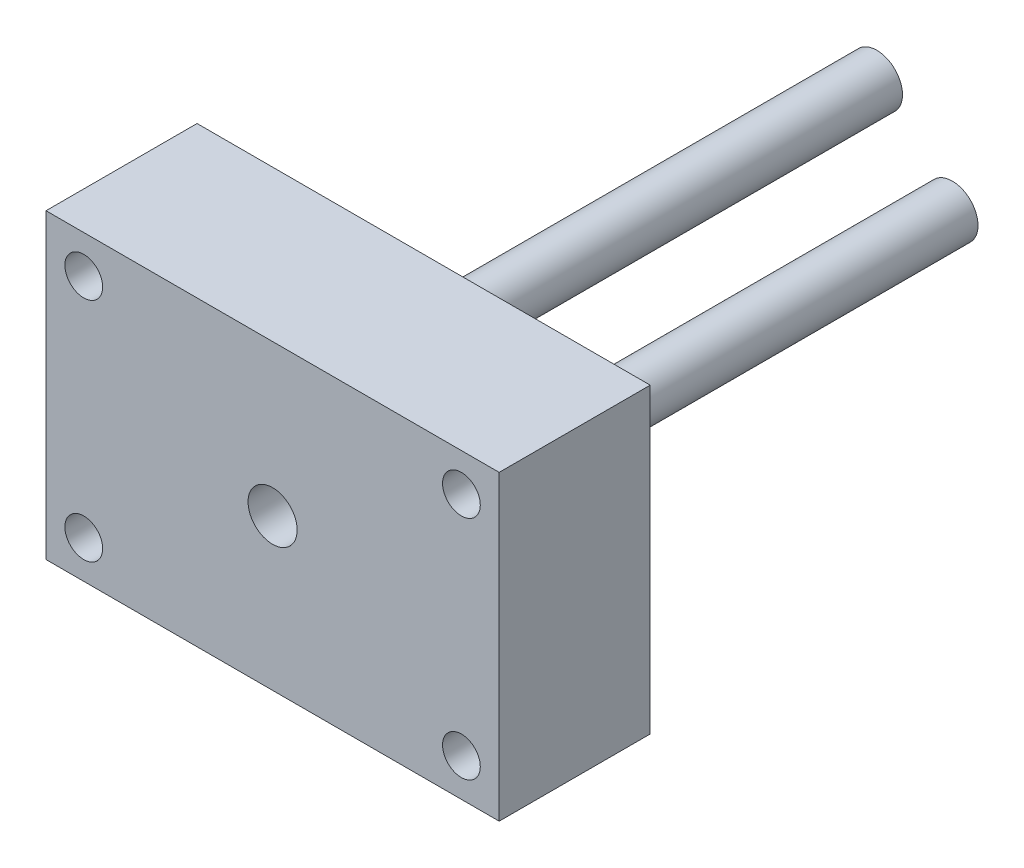
ISO-10303-21;
HEADER;
FILE_DESCRIPTION(('STEP AP214'),'2;1');
FILE_NAME('part.step','',(''),(''),'','','');
FILE_SCHEMA(('AUTOMOTIVE_DESIGN { 1 0 10303 214 1 1 1 1 }'));
ENDSEC;
DATA;
#1=APPLICATION_CONTEXT('core data for automotive mechanical design processes');
#2=APPLICATION_PROTOCOL_DEFINITION('international standard','automotive_design',2000,#1);
#3=PRODUCT_CONTEXT('',#1,'mechanical');
#4=PRODUCT('Part','Part','',(#3));
#5=PRODUCT_RELATED_PRODUCT_CATEGORY('part','',(#4));
#6=PRODUCT_DEFINITION_FORMATION('','',#4);
#7=PRODUCT_DEFINITION_CONTEXT('part definition',#1,'design');
#8=PRODUCT_DEFINITION('design','',#6,#7);
#9=PRODUCT_DEFINITION_SHAPE('','',#8);
#10=(LENGTH_UNIT() NAMED_UNIT(*) SI_UNIT(.MILLI.,.METRE.));
#11=(NAMED_UNIT(*) PLANE_ANGLE_UNIT() SI_UNIT($,.RADIAN.));
#12=(NAMED_UNIT(*) SI_UNIT($,.STERADIAN.) SOLID_ANGLE_UNIT());
#13=UNCERTAINTY_MEASURE_WITH_UNIT(LENGTH_MEASURE(1.E-05),#10,'distance_accuracy_value','');
#14=(GEOMETRIC_REPRESENTATION_CONTEXT(3) GLOBAL_UNCERTAINTY_ASSIGNED_CONTEXT((#13)) GLOBAL_UNIT_ASSIGNED_CONTEXT((#10,
#11,#12)) REPRESENTATION_CONTEXT('',''));
#15=CARTESIAN_POINT('',(0.,0.,0.));
#16=DIRECTION('',(0.,0.,1.));
#17=DIRECTION('',(1.,0.,0.));
#18=AXIS2_PLACEMENT_3D('',#15,#16,#17);
#19=CARTESIAN_POINT('',(0.,0.,25.4));
#20=DIRECTION('',(0.,0.,-1.));
#21=DIRECTION('',(-1.,0.,0.));
#22=AXIS2_PLACEMENT_3D('',#19,#20,#21);
#23=PLANE('',#22);
#24=CARTESIAN_POINT('',(69.8500000000004,6.34999999999999,25.4));
#25=DIRECTION('',(0.,0.,1.));
#26=DIRECTION('',(1.,0.,0.));
#27=AXIS2_PLACEMENT_3D('',#24,#25,#26);
#28=CIRCLE('',#27,3.175);
#29=CARTESIAN_POINT('',(73.0250000000004,6.34999999999999,25.4));
#30=VERTEX_POINT('',#29);
#31=EDGE_CURVE('E232',#30,#30,#28,.T.);
#32=ORIENTED_EDGE('',*,*,#31,.F.);
#33=EDGE_LOOP('',(#32));
#34=FACE_BOUND('',#33,.T.);
#35=CARTESIAN_POINT('',(6.3500000000004,6.34999999999999,25.4));
#36=DIRECTION('',(0.,0.,1.));
#37=DIRECTION('',(1.,0.,0.));
#38=AXIS2_PLACEMENT_3D('',#35,#36,#37);
#39=CIRCLE('',#38,3.175);
#40=CARTESIAN_POINT('',(9.5250000000004,6.34999999999999,25.4));
#41=VERTEX_POINT('',#40);
#42=EDGE_CURVE('E264',#41,#41,#39,.T.);
#43=ORIENTED_EDGE('',*,*,#42,.F.);
#44=EDGE_LOOP('',(#43));
#45=FACE_BOUND('',#44,.T.);
#46=CARTESIAN_POINT('',(69.85,44.45,25.4));
#47=DIRECTION('',(0.,0.,1.));
#48=DIRECTION('',(1.,0.,0.));
#49=AXIS2_PLACEMENT_3D('',#46,#47,#48);
#50=CIRCLE('',#49,3.175);
#51=CARTESIAN_POINT('',(73.025,44.45,25.4));
#52=VERTEX_POINT('',#51);
#53=EDGE_CURVE('E256',#52,#52,#50,.T.);
#54=ORIENTED_EDGE('',*,*,#53,.F.);
#55=EDGE_LOOP('',(#54));
#56=FACE_BOUND('',#55,.T.);
#57=CARTESIAN_POINT('',(6.35,44.45,25.4));
#58=DIRECTION('',(0.,0.,1.));
#59=DIRECTION('',(1.,0.,0.));
#60=AXIS2_PLACEMENT_3D('',#57,#58,#59);
#61=CIRCLE('',#60,3.175);
#62=CARTESIAN_POINT('',(9.525,44.45,25.4));
#63=VERTEX_POINT('',#62);
#64=EDGE_CURVE('E248',#63,#63,#61,.T.);
#65=ORIENTED_EDGE('',*,*,#64,.F.);
#66=EDGE_LOOP('',(#65));
#67=FACE_BOUND('',#66,.T.);
#68=CARTESIAN_POINT('',(38.1,25.4,25.4));
#69=DIRECTION('',(0.,0.,1.));
#70=DIRECTION('',(1.,0.,0.));
#71=AXIS2_PLACEMENT_3D('',#68,#69,#70);
#72=CIRCLE('',#71,4.1275);
#73=CARTESIAN_POINT('',(42.2275,25.4,25.4));
#74=VERTEX_POINT('',#73);
#75=EDGE_CURVE('E247',#74,#74,#72,.T.);
#76=ORIENTED_EDGE('',*,*,#75,.F.);
#77=EDGE_LOOP('',(#76));
#78=FACE_BOUND('',#77,.T.);
#79=DIRECTION('',(0.,-1.,0.));
#80=VECTOR('',#79,1.);
#81=CARTESIAN_POINT('',(0.,0.,25.4));
#82=LINE('',#81,#80);
#83=CARTESIAN_POINT('',(0.,50.8,25.4));
#84=VERTEX_POINT('',#83);
#85=CARTESIAN_POINT('',(0.,0.,25.4));
#86=VERTEX_POINT('',#85);
#87=EDGE_CURVE('E95',#84,#86,#82,.T.);
#88=ORIENTED_EDGE('',*,*,#87,.T.);
#89=DIRECTION('',(1.,0.,0.));
#90=VECTOR('',#89,1.);
#91=CARTESIAN_POINT('',(0.,0.,25.4));
#92=LINE('',#91,#90);
#93=CARTESIAN_POINT('',(76.2,0.,25.4));
#94=VERTEX_POINT('',#93);
#95=EDGE_CURVE('E91',#86,#94,#92,.T.);
#96=ORIENTED_EDGE('',*,*,#95,.T.);
#97=DIRECTION('',(0.,1.,0.));
#98=VECTOR('',#97,1.);
#99=CARTESIAN_POINT('',(76.2,0.,25.4));
#100=LINE('',#99,#98);
#101=CARTESIAN_POINT('',(76.2,50.8,25.4));
#102=VERTEX_POINT('',#101);
#103=EDGE_CURVE('E93',#94,#102,#100,.T.);
#104=ORIENTED_EDGE('',*,*,#103,.T.);
#105=DIRECTION('',(-1.,0.,0.));
#106=VECTOR('',#105,1.);
#107=CARTESIAN_POINT('',(0.,50.8,25.4));
#108=LINE('',#107,#106);
#109=EDGE_CURVE('E61',#102,#84,#108,.T.);
#110=ORIENTED_EDGE('',*,*,#109,.T.);
#111=EDGE_LOOP('',(#88,#96,#104,#110));
#112=FACE_BOUND('',#111,.T.);
#113=ADVANCED_FACE('F39',(#34,#45,#56,#67,#78,#112),#23,.F.);
#114=CARTESIAN_POINT('',(0.,0.,0.));
#115=DIRECTION('',(0.,0.,-1.));
#116=DIRECTION('',(-1.,0.,0.));
#117=AXIS2_PLACEMENT_3D('',#114,#115,#116);
#118=PLANE('',#117);
#119=CARTESIAN_POINT('',(38.0978420618941,38.1012632859385,0.));
#120=DIRECTION('',(0.,0.,-1.));
#121=DIRECTION('',(0.862996570072247,-0.50520977825408,0.));
#122=AXIS2_PLACEMENT_3D('',#119,#120,#121);
#123=CIRCLE('',#122,4.31615582770865);
#124=CARTESIAN_POINT('',(41.822669737104,35.9206991573118,0.));
#125=VERTEX_POINT('',#124);
#126=EDGE_CURVE('E129',#125,#125,#123,.T.);
#127=ORIENTED_EDGE('',*,*,#126,.F.);
#128=EDGE_LOOP('',(#127));
#129=FACE_BOUND('',#128,.T.);
#130=CARTESIAN_POINT('',(69.8500000000004,6.34999999999999,0.));
#131=DIRECTION('',(0.,0.,1.));
#132=DIRECTION('',(1.,0.,0.));
#133=AXIS2_PLACEMENT_3D('',#130,#131,#132);
#134=CIRCLE('',#133,3.175);
#135=CARTESIAN_POINT('',(73.0250000000004,6.34999999999999,0.));
#136=VERTEX_POINT('',#135);
#137=EDGE_CURVE('E238',#136,#136,#134,.T.);
#138=ORIENTED_EDGE('',*,*,#137,.T.);
#139=EDGE_LOOP('',(#138));
#140=FACE_BOUND('',#139,.T.);
#141=CARTESIAN_POINT('',(6.3500000000004,6.34999999999999,0.));
#142=DIRECTION('',(0.,0.,1.));
#143=DIRECTION('',(1.,0.,0.));
#144=AXIS2_PLACEMENT_3D('',#141,#142,#143);
#145=CIRCLE('',#144,3.175);
#146=CARTESIAN_POINT('',(9.5250000000004,6.34999999999999,0.));
#147=VERTEX_POINT('',#146);
#148=EDGE_CURVE('E260',#147,#147,#145,.T.);
#149=ORIENTED_EDGE('',*,*,#148,.T.);
#150=EDGE_LOOP('',(#149));
#151=FACE_BOUND('',#150,.T.);
#152=CARTESIAN_POINT('',(69.85,44.45,0.));
#153=DIRECTION('',(0.,0.,1.));
#154=DIRECTION('',(1.,0.,0.));
#155=AXIS2_PLACEMENT_3D('',#152,#153,#154);
#156=CIRCLE('',#155,3.175);
#157=CARTESIAN_POINT('',(73.025,44.45,0.));
#158=VERTEX_POINT('',#157);
#159=EDGE_CURVE('E252',#158,#158,#156,.T.);
#160=ORIENTED_EDGE('',*,*,#159,.T.);
#161=EDGE_LOOP('',(#160));
#162=FACE_BOUND('',#161,.T.);
#163=CARTESIAN_POINT('',(6.35,44.45,0.));
#164=DIRECTION('',(0.,0.,1.));
#165=DIRECTION('',(1.,0.,0.));
#166=AXIS2_PLACEMENT_3D('',#163,#164,#165);
#167=CIRCLE('',#166,3.175);
#168=CARTESIAN_POINT('',(9.525,44.45,0.));
#169=VERTEX_POINT('',#168);
#170=EDGE_CURVE('E243',#169,#169,#167,.T.);
#171=ORIENTED_EDGE('',*,*,#170,.T.);
#172=EDGE_LOOP('',(#171));
#173=FACE_BOUND('',#172,.T.);
#174=CARTESIAN_POINT('',(38.1,25.4,0.));
#175=DIRECTION('',(0.,0.,1.));
#176=DIRECTION('',(1.,0.,0.));
#177=AXIS2_PLACEMENT_3D('',#174,#175,#176);
#178=CIRCLE('',#177,4.1275);
#179=CARTESIAN_POINT('',(42.2275,25.4,0.));
#180=VERTEX_POINT('',#179);
#181=EDGE_CURVE('E116',#180,#180,#178,.T.);
#182=ORIENTED_EDGE('',*,*,#181,.T.);
#183=EDGE_LOOP('',(#182));
#184=FACE_BOUND('',#183,.T.);
#185=CARTESIAN_POINT('',(38.1000000000088,12.7,0.));
#186=DIRECTION('',(0.,0.,-1.));
#187=DIRECTION('',(-1.,0.,0.));
#188=AXIS2_PLACEMENT_3D('',#185,#186,#187);
#189=CIRCLE('',#188,4.31365531013888);
#190=CARTESIAN_POINT('',(33.7863446898699,12.7,0.));
#191=VERTEX_POINT('',#190);
#192=EDGE_CURVE('E143',#191,#191,#189,.T.);
#193=ORIENTED_EDGE('',*,*,#192,.F.);
#194=EDGE_LOOP('',(#193));
#195=FACE_BOUND('',#194,.T.);
#196=DIRECTION('',(0.,-1.,0.));
#197=VECTOR('',#196,1.);
#198=CARTESIAN_POINT('',(0.,0.,0.));
#199=LINE('',#198,#197);
#200=CARTESIAN_POINT('',(0.,50.8,0.));
#201=VERTEX_POINT('',#200);
#202=CARTESIAN_POINT('',(0.,0.,0.));
#203=VERTEX_POINT('',#202);
#204=EDGE_CURVE('E112',#201,#203,#199,.T.);
#205=ORIENTED_EDGE('',*,*,#204,.F.);
#206=DIRECTION('',(-1.,0.,0.));
#207=VECTOR('',#206,1.);
#208=CARTESIAN_POINT('',(0.,50.8,0.));
#209=LINE('',#208,#207);
#210=CARTESIAN_POINT('',(76.2,50.8,0.));
#211=VERTEX_POINT('',#210);
#212=EDGE_CURVE('E84',#211,#201,#209,.T.);
#213=ORIENTED_EDGE('',*,*,#212,.F.);
#214=DIRECTION('',(0.,1.,0.));
#215=VECTOR('',#214,1.);
#216=CARTESIAN_POINT('',(76.2,0.,0.));
#217=LINE('',#216,#215);
#218=CARTESIAN_POINT('',(76.2,0.,0.));
#219=VERTEX_POINT('',#218);
#220=EDGE_CURVE('E78',#219,#211,#217,.T.);
#221=ORIENTED_EDGE('',*,*,#220,.F.);
#222=DIRECTION('',(1.,0.,0.));
#223=VECTOR('',#222,1.);
#224=CARTESIAN_POINT('',(0.,0.,0.));
#225=LINE('',#224,#223);
#226=EDGE_CURVE('E100',#203,#219,#225,.T.);
#227=ORIENTED_EDGE('',*,*,#226,.F.);
#228=EDGE_LOOP('',(#205,#213,#221,#227));
#229=FACE_BOUND('',#228,.T.);
#230=CARTESIAN_POINT('',(50.8000000000044,25.4000000000044,0.));
#231=DIRECTION('',(0.,0.,-1.));
#232=DIRECTION('',(-1.,0.,0.));
#233=AXIS2_PLACEMENT_3D('',#230,#231,#232);
#234=CIRCLE('',#233,4.31365531011594);
#235=CARTESIAN_POINT('',(46.4863446898885,25.4000000000044,0.));
#236=VERTEX_POINT('',#235);
#237=EDGE_CURVE('E140',#236,#236,#234,.T.);
#238=ORIENTED_EDGE('',*,*,#237,.F.);
#239=EDGE_LOOP('',(#238));
#240=FACE_BOUND('',#239,.T.);
#241=CARTESIAN_POINT('',(25.4000000000044,25.3999999999957,0.));
#242=DIRECTION('',(0.,0.,-1.));
#243=DIRECTION('',(-1.,0.,0.));
#244=AXIS2_PLACEMENT_3D('',#241,#242,#243);
#245=CIRCLE('',#244,4.31365531011593);
#246=CARTESIAN_POINT('',(21.0863446898885,25.3999999999957,0.));
#247=VERTEX_POINT('',#246);
#248=EDGE_CURVE('E230',#247,#247,#245,.T.);
#249=ORIENTED_EDGE('',*,*,#248,.F.);
#250=EDGE_LOOP('',(#249));
#251=FACE_BOUND('',#250,.T.);
#252=ADVANCED_FACE('F130',(#129,#140,#151,#162,#173,#184,#195,#229,#240,#251),#118,.T.);
#253=CARTESIAN_POINT('',(0.,0.,25.4));
#254=DIRECTION('',(1.,0.,0.));
#255=DIRECTION('',(0.,0.,-1.));
#256=AXIS2_PLACEMENT_3D('',#253,#254,#255);
#257=PLANE('',#256);
#258=ORIENTED_EDGE('',*,*,#204,.T.);
#259=DIRECTION('',(0.,0.,-1.));
#260=VECTOR('',#259,1.);
#261=CARTESIAN_POINT('',(0.,0.,25.4));
#262=LINE('',#261,#260);
#263=EDGE_CURVE('E11',#86,#203,#262,.T.);
#264=ORIENTED_EDGE('',*,*,#263,.F.);
#265=ORIENTED_EDGE('',*,*,#87,.F.);
#266=DIRECTION('',(0.,0.,-1.));
#267=VECTOR('',#266,1.);
#268=CARTESIAN_POINT('',(0.,50.8,25.4));
#269=LINE('',#268,#267);
#270=EDGE_CURVE('E108',#84,#201,#269,.T.);
#271=ORIENTED_EDGE('',*,*,#270,.T.);
#272=EDGE_LOOP('',(#258,#264,#265,#271));
#273=FACE_BOUND('',#272,.T.);
#274=ADVANCED_FACE('F41',(#273),#257,.F.);
#275=CARTESIAN_POINT('',(0.,0.,25.4));
#276=DIRECTION('',(0.,1.,0.));
#277=DIRECTION('',(0.,0.,1.));
#278=AXIS2_PLACEMENT_3D('',#275,#276,#277);
#279=PLANE('',#278);
#280=ORIENTED_EDGE('',*,*,#226,.T.);
#281=DIRECTION('',(0.,0.,-1.));
#282=VECTOR('',#281,1.);
#283=CARTESIAN_POINT('',(76.2,0.,25.4));
#284=LINE('',#283,#282);
#285=EDGE_CURVE('E52',#94,#219,#284,.T.);
#286=ORIENTED_EDGE('',*,*,#285,.F.);
#287=ORIENTED_EDGE('',*,*,#95,.F.);
#288=ORIENTED_EDGE('',*,*,#263,.T.);
#289=EDGE_LOOP('',(#280,#286,#287,#288));
#290=FACE_BOUND('',#289,.T.);
#291=ADVANCED_FACE('F99',(#290),#279,.F.);
#292=CARTESIAN_POINT('',(76.2,0.,25.4));
#293=DIRECTION('',(-1.,0.,0.));
#294=DIRECTION('',(0.,0.,1.));
#295=AXIS2_PLACEMENT_3D('',#292,#293,#294);
#296=PLANE('',#295);
#297=ORIENTED_EDGE('',*,*,#220,.T.);
#298=DIRECTION('',(0.,0.,-1.));
#299=VECTOR('',#298,1.);
#300=CARTESIAN_POINT('',(76.2,50.8,25.4));
#301=LINE('',#300,#299);
#302=EDGE_CURVE('E102',#102,#211,#301,.T.);
#303=ORIENTED_EDGE('',*,*,#302,.F.);
#304=ORIENTED_EDGE('',*,*,#103,.F.);
#305=ORIENTED_EDGE('',*,*,#285,.T.);
#306=EDGE_LOOP('',(#297,#303,#304,#305));
#307=FACE_BOUND('',#306,.T.);
#308=ADVANCED_FACE('F104',(#307),#296,.F.);
#309=CARTESIAN_POINT('',(0.,50.8,25.4));
#310=DIRECTION('',(0.,-1.,0.));
#311=DIRECTION('',(0.,0.,-1.));
#312=AXIS2_PLACEMENT_3D('',#309,#310,#311);
#313=PLANE('',#312);
#314=ORIENTED_EDGE('',*,*,#212,.T.);
#315=ORIENTED_EDGE('',*,*,#270,.F.);
#316=ORIENTED_EDGE('',*,*,#109,.F.);
#317=ORIENTED_EDGE('',*,*,#302,.T.);
#318=EDGE_LOOP('',(#314,#315,#316,#317));
#319=FACE_BOUND('',#318,.T.);
#320=ADVANCED_FACE('F205',(#319),#313,.F.);
#321=CARTESIAN_POINT('',(38.1,25.4,0.));
#322=DIRECTION('',(0.,0.,1.));
#323=DIRECTION('',(1.,0.,0.));
#324=AXIS2_PLACEMENT_3D('',#321,#322,#323);
#325=CYLINDRICAL_SURFACE('',#324,4.1275);
#326=ORIENTED_EDGE('',*,*,#181,.F.);
#327=EDGE_LOOP('',(#326));
#328=FACE_BOUND('',#327,.T.);
#329=ORIENTED_EDGE('',*,*,#75,.T.);
#330=EDGE_LOOP('',(#329));
#331=FACE_BOUND('',#330,.T.);
#332=ADVANCED_FACE('F191',(#328,#331),#325,.F.);
#333=CARTESIAN_POINT('',(6.35,44.45,0.));
#334=DIRECTION('',(0.,0.,1.));
#335=DIRECTION('',(1.,0.,0.));
#336=AXIS2_PLACEMENT_3D('',#333,#334,#335);
#337=CYLINDRICAL_SURFACE('',#336,3.175);
#338=ORIENTED_EDGE('',*,*,#170,.F.);
#339=EDGE_LOOP('',(#338));
#340=FACE_BOUND('',#339,.T.);
#341=ORIENTED_EDGE('',*,*,#64,.T.);
#342=EDGE_LOOP('',(#341));
#343=FACE_BOUND('',#342,.T.);
#344=ADVANCED_FACE('F187',(#340,#343),#337,.F.);
#345=CARTESIAN_POINT('',(69.85,44.45,0.));
#346=DIRECTION('',(0.,0.,1.));
#347=DIRECTION('',(1.,0.,0.));
#348=AXIS2_PLACEMENT_3D('',#345,#346,#347);
#349=CYLINDRICAL_SURFACE('',#348,3.175);
#350=ORIENTED_EDGE('',*,*,#159,.F.);
#351=EDGE_LOOP('',(#350));
#352=FACE_BOUND('',#351,.T.);
#353=ORIENTED_EDGE('',*,*,#53,.T.);
#354=EDGE_LOOP('',(#353));
#355=FACE_BOUND('',#354,.T.);
#356=ADVANCED_FACE('F190',(#352,#355),#349,.F.);
#357=CARTESIAN_POINT('',(6.3500000000004,6.34999999999999,0.));
#358=DIRECTION('',(0.,0.,1.));
#359=DIRECTION('',(1.,0.,0.));
#360=AXIS2_PLACEMENT_3D('',#357,#358,#359);
#361=CYLINDRICAL_SURFACE('',#360,3.175);
#362=ORIENTED_EDGE('',*,*,#148,.F.);
#363=EDGE_LOOP('',(#362));
#364=FACE_BOUND('',#363,.T.);
#365=ORIENTED_EDGE('',*,*,#42,.T.);
#366=EDGE_LOOP('',(#365));
#367=FACE_BOUND('',#366,.T.);
#368=ADVANCED_FACE('F195',(#364,#367),#361,.F.);
#369=CARTESIAN_POINT('',(69.8500000000004,6.34999999999999,0.));
#370=DIRECTION('',(0.,0.,1.));
#371=DIRECTION('',(1.,0.,0.));
#372=AXIS2_PLACEMENT_3D('',#369,#370,#371);
#373=CYLINDRICAL_SURFACE('',#372,3.175);
#374=ORIENTED_EDGE('',*,*,#137,.F.);
#375=EDGE_LOOP('',(#374));
#376=FACE_BOUND('',#375,.T.);
#377=ORIENTED_EDGE('',*,*,#31,.T.);
#378=EDGE_LOOP('',(#377));
#379=FACE_BOUND('',#378,.T.);
#380=ADVANCED_FACE('F185',(#376,#379),#373,.F.);
#381=CARTESIAN_POINT('',(25.4000000000044,25.3999999999957,-76.2));
#382=DIRECTION('',(0.,0.,1.));
#383=DIRECTION('',(1.,0.,0.));
#384=AXIS2_PLACEMENT_3D('',#381,#382,#383);
#385=CYLINDRICAL_SURFACE('',#384,4.31365531011593);
#386=ORIENTED_EDGE('',*,*,#248,.T.);
#387=EDGE_LOOP('',(#386));
#388=FACE_BOUND('',#387,.T.);
#389=CARTESIAN_POINT('',(25.4000000000044,25.3999999999957,-76.2));
#390=DIRECTION('',(0.,0.,1.));
#391=DIRECTION('',(1.,0.,0.));
#392=AXIS2_PLACEMENT_3D('',#389,#390,#391);
#393=CIRCLE('',#392,4.31365531011593);
#394=CARTESIAN_POINT('',(29.7136553101204,25.3999999999957,-76.2));
#395=VERTEX_POINT('',#394);
#396=EDGE_CURVE('E233',#395,#395,#393,.T.);
#397=ORIENTED_EDGE('',*,*,#396,.T.);
#398=EDGE_LOOP('',(#397));
#399=FACE_BOUND('',#398,.T.);
#400=ADVANCED_FACE('F181',(#388,#399),#385,.T.);
#401=CARTESIAN_POINT('',(25.4000000000044,25.3999999999957,-76.2));
#402=DIRECTION('',(0.,0.,1.));
#403=DIRECTION('',(1.,0.,0.));
#404=AXIS2_PLACEMENT_3D('',#401,#402,#403);
#405=PLANE('',#404);
#406=ORIENTED_EDGE('',*,*,#396,.F.);
#407=EDGE_LOOP('',(#406));
#408=FACE_BOUND('',#407,.T.);
#409=ADVANCED_FACE('F177',(#408),#405,.F.);
#410=CARTESIAN_POINT('',(50.8000000000044,25.4000000000044,-76.2));
#411=DIRECTION('',(0.,0.,1.));
#412=DIRECTION('',(1.,0.,0.));
#413=AXIS2_PLACEMENT_3D('',#410,#411,#412);
#414=CYLINDRICAL_SURFACE('',#413,4.31365531011594);
#415=ORIENTED_EDGE('',*,*,#237,.T.);
#416=EDGE_LOOP('',(#415));
#417=FACE_BOUND('',#416,.T.);
#418=CARTESIAN_POINT('',(50.8000000000044,25.4000000000044,-76.2));
#419=DIRECTION('',(0.,0.,1.));
#420=DIRECTION('',(1.,0.,0.));
#421=AXIS2_PLACEMENT_3D('',#418,#419,#420);
#422=CIRCLE('',#421,4.31365531011594);
#423=CARTESIAN_POINT('',(55.1136553101204,25.4000000000044,-76.2));
#424=VERTEX_POINT('',#423);
#425=EDGE_CURVE('E135',#424,#424,#422,.T.);
#426=ORIENTED_EDGE('',*,*,#425,.T.);
#427=EDGE_LOOP('',(#426));
#428=FACE_BOUND('',#427,.T.);
#429=ADVANCED_FACE('F173',(#417,#428),#414,.T.);
#430=CARTESIAN_POINT('',(50.8000000000044,25.4000000000044,-76.2));
#431=DIRECTION('',(0.,0.,1.));
#432=DIRECTION('',(1.,0.,0.));
#433=AXIS2_PLACEMENT_3D('',#430,#431,#432);
#434=PLANE('',#433);
#435=ORIENTED_EDGE('',*,*,#425,.F.);
#436=EDGE_LOOP('',(#435));
#437=FACE_BOUND('',#436,.T.);
#438=ADVANCED_FACE('F170',(#437),#434,.F.);
#439=CARTESIAN_POINT('',(38.0978420618941,38.1012632859385,-76.2));
#440=DIRECTION('',(0.,0.,1.));
#441=DIRECTION('',(1.,0.,0.));
#442=AXIS2_PLACEMENT_3D('',#439,#440,#441);
#443=PLANE('',#442);
#444=CARTESIAN_POINT('',(38.0978420618941,38.1012632859385,-76.2));
#445=DIRECTION('',(0.,0.,1.));
#446=DIRECTION('',(1.,0.,0.));
#447=AXIS2_PLACEMENT_3D('',#444,#445,#446);
#448=CIRCLE('',#447,4.31615582770865);
#449=CARTESIAN_POINT('',(42.4139978896027,38.1012632859385,-76.2));
#450=VERTEX_POINT('',#449);
#451=EDGE_CURVE('E136',#450,#450,#448,.T.);
#452=ORIENTED_EDGE('',*,*,#451,.F.);
#453=EDGE_LOOP('',(#452));
#454=FACE_BOUND('',#453,.T.);
#455=ADVANCED_FACE('F168',(#454),#443,.F.);
#456=CARTESIAN_POINT('',(38.0978420618941,38.1012632859385,-76.2));
#457=DIRECTION('',(0.,0.,1.));
#458=DIRECTION('',(1.,0.,0.));
#459=AXIS2_PLACEMENT_3D('',#456,#457,#458);
#460=CYLINDRICAL_SURFACE('',#459,4.31615582770865);
#461=ORIENTED_EDGE('',*,*,#126,.T.);
#462=EDGE_LOOP('',(#461));
#463=FACE_BOUND('',#462,.T.);
#464=ORIENTED_EDGE('',*,*,#451,.T.);
#465=EDGE_LOOP('',(#464));
#466=FACE_BOUND('',#465,.T.);
#467=ADVANCED_FACE('F157',(#463,#466),#460,.T.);
#468=CARTESIAN_POINT('',(38.1000000000088,12.7,-76.2));
#469=DIRECTION('',(0.,0.,1.));
#470=DIRECTION('',(1.,0.,0.));
#471=AXIS2_PLACEMENT_3D('',#468,#469,#470);
#472=CYLINDRICAL_SURFACE('',#471,4.31365531013888);
#473=ORIENTED_EDGE('',*,*,#192,.T.);
#474=EDGE_LOOP('',(#473));
#475=FACE_BOUND('',#474,.T.);
#476=CARTESIAN_POINT('',(38.1000000000088,12.7,-76.2));
#477=DIRECTION('',(0.,0.,1.));
#478=DIRECTION('',(1.,0.,0.));
#479=AXIS2_PLACEMENT_3D('',#476,#477,#478);
#480=CIRCLE('',#479,4.31365531013888);
#481=CARTESIAN_POINT('',(42.4136553101477,12.7,-76.2));
#482=VERTEX_POINT('',#481);
#483=EDGE_CURVE('E149',#482,#482,#480,.T.);
#484=ORIENTED_EDGE('',*,*,#483,.T.);
#485=EDGE_LOOP('',(#484));
#486=FACE_BOUND('',#485,.T.);
#487=ADVANCED_FACE('F167',(#475,#486),#472,.T.);
#488=CARTESIAN_POINT('',(38.1000000000088,12.7,-76.2));
#489=DIRECTION('',(0.,0.,1.));
#490=DIRECTION('',(1.,0.,0.));
#491=AXIS2_PLACEMENT_3D('',#488,#489,#490);
#492=PLANE('',#491);
#493=ORIENTED_EDGE('',*,*,#483,.F.);
#494=EDGE_LOOP('',(#493));
#495=FACE_BOUND('',#494,.T.);
#496=ADVANCED_FACE('F287',(#495),#492,.F.);
#497=CLOSED_SHELL('',(#113,#252,#274,#291,#308,#320,#332,#344,#356,#368,#380,#400,#409,#429,
#438,#455,#467,#487,#496));
#498=MANIFOLD_SOLID_BREP('B2',#497);
#499=ADVANCED_BREP_SHAPE_REPRESENTATION('',(#18,#498),#14);
#500=SHAPE_DEFINITION_REPRESENTATION(#9,#499);
ENDSEC;
END-ISO-10303-21;
